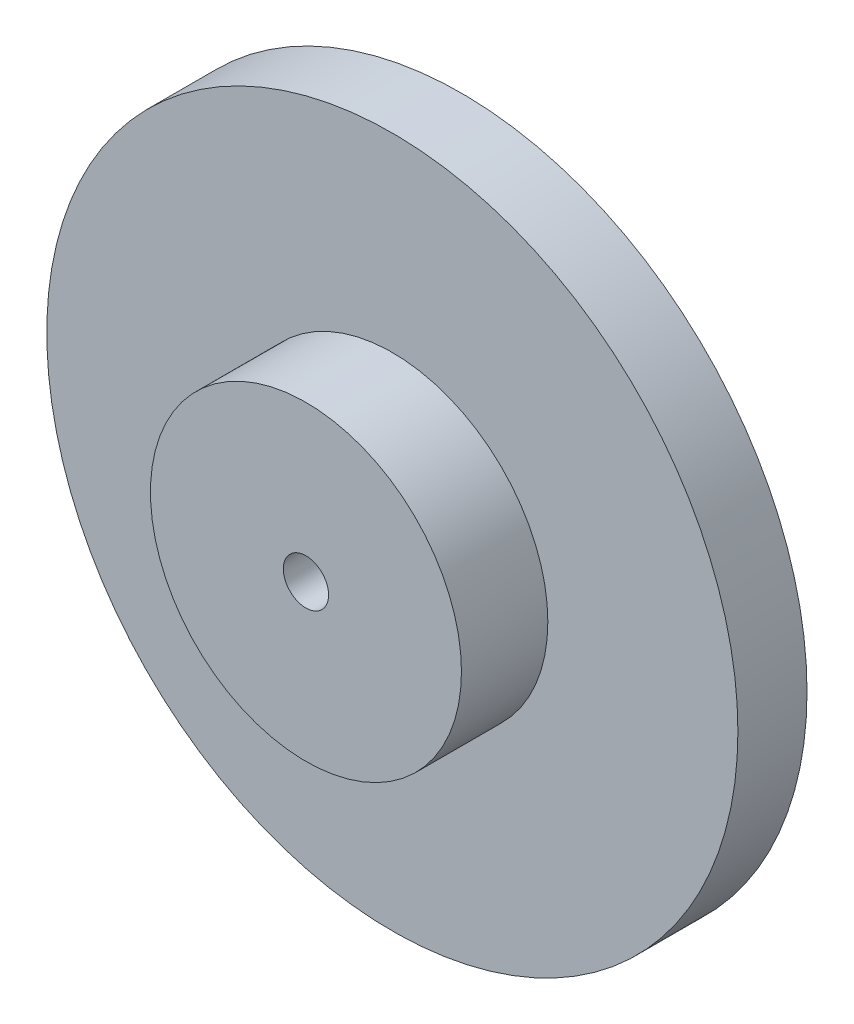
ISO-10303-21;
HEADER;
FILE_DESCRIPTION(('STEP AP214'),'2;1');
FILE_NAME('part.step','',(''),(''),'','','');
FILE_SCHEMA(('AUTOMOTIVE_DESIGN { 1 0 10303 214 1 1 1 1 }'));
ENDSEC;
DATA;
#1=APPLICATION_CONTEXT('core data for automotive mechanical design processes');
#2=APPLICATION_PROTOCOL_DEFINITION('international standard','automotive_design',2000,#1);
#3=PRODUCT_CONTEXT('',#1,'mechanical');
#4=PRODUCT('Part','Part','',(#3));
#5=PRODUCT_RELATED_PRODUCT_CATEGORY('part','',(#4));
#6=PRODUCT_DEFINITION_FORMATION('','',#4);
#7=PRODUCT_DEFINITION_CONTEXT('part definition',#1,'design');
#8=PRODUCT_DEFINITION('design','',#6,#7);
#9=PRODUCT_DEFINITION_SHAPE('','',#8);
#10=(LENGTH_UNIT() NAMED_UNIT(*) SI_UNIT(.MILLI.,.METRE.));
#11=(NAMED_UNIT(*) PLANE_ANGLE_UNIT() SI_UNIT($,.RADIAN.));
#12=(NAMED_UNIT(*) SI_UNIT($,.STERADIAN.) SOLID_ANGLE_UNIT());
#13=UNCERTAINTY_MEASURE_WITH_UNIT(LENGTH_MEASURE(1.E-05),#10,'distance_accuracy_value','');
#14=(GEOMETRIC_REPRESENTATION_CONTEXT(3) GLOBAL_UNCERTAINTY_ASSIGNED_CONTEXT((#13)) GLOBAL_UNIT_ASSIGNED_CONTEXT((#10,
#11,#12)) REPRESENTATION_CONTEXT('',''));
#15=CARTESIAN_POINT('',(0.,0.,0.));
#16=DIRECTION('',(0.,0.,1.));
#17=DIRECTION('',(1.,0.,0.));
#18=AXIS2_PLACEMENT_3D('',#15,#16,#17);
#19=CARTESIAN_POINT('',(0.,0.,2.));
#20=DIRECTION('',(0.,0.,-1.));
#21=DIRECTION('',(-1.,0.,0.));
#22=AXIS2_PLACEMENT_3D('',#19,#20,#21);
#23=CYLINDRICAL_SURFACE('',#22,10.);
#24=CARTESIAN_POINT('',(0.,0.,2.));
#25=DIRECTION('',(0.,0.,1.));
#26=DIRECTION('',(1.,0.,0.));
#27=AXIS2_PLACEMENT_3D('',#24,#25,#26);
#28=CIRCLE('',#27,10.);
#29=CARTESIAN_POINT('',(10.,0.,2.));
#30=VERTEX_POINT('',#29);
#31=EDGE_CURVE('E44',#30,#30,#28,.T.);
#32=ORIENTED_EDGE('',*,*,#31,.F.);
#33=EDGE_LOOP('',(#32));
#34=FACE_BOUND('',#33,.T.);
#35=CARTESIAN_POINT('',(0.,0.,0.));
#36=DIRECTION('',(0.,0.,1.));
#37=DIRECTION('',(1.,0.,0.));
#38=AXIS2_PLACEMENT_3D('',#35,#36,#37);
#39=CIRCLE('',#38,10.);
#40=CARTESIAN_POINT('',(10.,0.,0.));
#41=VERTEX_POINT('',#40);
#42=EDGE_CURVE('E40',#41,#41,#39,.T.);
#43=ORIENTED_EDGE('',*,*,#42,.T.);
#44=EDGE_LOOP('',(#43));
#45=FACE_BOUND('',#44,.T.);
#46=ADVANCED_FACE('F37',(#34,#45),#23,.T.);
#47=CARTESIAN_POINT('',(0.,0.,2.));
#48=DIRECTION('',(0.,0.,1.));
#49=DIRECTION('',(1.,0.,0.));
#50=AXIS2_PLACEMENT_3D('',#47,#48,#49);
#51=PLANE('',#50);
#52=CARTESIAN_POINT('',(0.,0.,2.));
#53=DIRECTION('',(0.,0.,1.));
#54=DIRECTION('',(1.,0.,0.));
#55=AXIS2_PLACEMENT_3D('',#52,#53,#54);
#56=CIRCLE('',#55,4.5);
#57=CARTESIAN_POINT('',(4.5,0.,2.));
#58=VERTEX_POINT('',#57);
#59=EDGE_CURVE('E10',#58,#58,#56,.T.);
#60=ORIENTED_EDGE('',*,*,#59,.F.);
#61=EDGE_LOOP('',(#60));
#62=FACE_BOUND('',#61,.T.);
#63=ORIENTED_EDGE('',*,*,#31,.T.);
#64=EDGE_LOOP('',(#63));
#65=FACE_BOUND('',#64,.T.);
#66=ADVANCED_FACE('F77',(#62,#65),#51,.T.);
#67=CARTESIAN_POINT('',(0.,0.,0.));
#68=DIRECTION('',(0.,0.,1.));
#69=DIRECTION('',(1.,0.,0.));
#70=AXIS2_PLACEMENT_3D('',#67,#68,#69);
#71=PLANE('',#70);
#72=CARTESIAN_POINT('',(0.,0.,0.));
#73=DIRECTION('',(0.,0.,1.));
#74=DIRECTION('',(1.,0.,0.));
#75=AXIS2_PLACEMENT_3D('',#72,#73,#74);
#76=CIRCLE('',#75,0.655025597228106);
#77=CARTESIAN_POINT('',(0.655025597228106,0.,0.));
#78=VERTEX_POINT('',#77);
#79=EDGE_CURVE('E53',#78,#78,#76,.T.);
#80=ORIENTED_EDGE('',*,*,#79,.T.);
#81=EDGE_LOOP('',(#80));
#82=FACE_BOUND('',#81,.T.);
#83=ORIENTED_EDGE('',*,*,#42,.F.);
#84=EDGE_LOOP('',(#83));
#85=FACE_BOUND('',#84,.T.);
#86=ADVANCED_FACE('F71',(#82,#85),#71,.F.);
#87=CARTESIAN_POINT('',(0.,0.,4.5));
#88=DIRECTION('',(0.,0.,-1.));
#89=DIRECTION('',(-1.,0.,0.));
#90=AXIS2_PLACEMENT_3D('',#87,#88,#89);
#91=CYLINDRICAL_SURFACE('',#90,4.5);
#92=CARTESIAN_POINT('',(0.,0.,4.5));
#93=DIRECTION('',(0.,0.,1.));
#94=DIRECTION('',(1.,0.,0.));
#95=AXIS2_PLACEMENT_3D('',#92,#93,#94);
#96=CIRCLE('',#95,4.5);
#97=CARTESIAN_POINT('',(4.5,0.,4.5));
#98=VERTEX_POINT('',#97);
#99=EDGE_CURVE('E50',#98,#98,#96,.T.);
#100=ORIENTED_EDGE('',*,*,#99,.F.);
#101=EDGE_LOOP('',(#100));
#102=FACE_BOUND('',#101,.T.);
#103=ORIENTED_EDGE('',*,*,#59,.T.);
#104=EDGE_LOOP('',(#103));
#105=FACE_BOUND('',#104,.T.);
#106=ADVANCED_FACE('F66',(#102,#105),#91,.T.);
#107=CARTESIAN_POINT('',(0.,0.,4.5));
#108=DIRECTION('',(0.,0.,1.));
#109=DIRECTION('',(1.,0.,0.));
#110=AXIS2_PLACEMENT_3D('',#107,#108,#109);
#111=PLANE('',#110);
#112=CARTESIAN_POINT('',(0.,0.,4.5));
#113=DIRECTION('',(0.,0.,1.));
#114=DIRECTION('',(1.,0.,0.));
#115=AXIS2_PLACEMENT_3D('',#112,#113,#114);
#116=CIRCLE('',#115,0.655025597228106);
#117=CARTESIAN_POINT('',(0.655025597228106,0.,4.5));
#118=VERTEX_POINT('',#117);
#119=EDGE_CURVE('E56',#118,#118,#116,.T.);
#120=ORIENTED_EDGE('',*,*,#119,.F.);
#121=EDGE_LOOP('',(#120));
#122=FACE_BOUND('',#121,.T.);
#123=ORIENTED_EDGE('',*,*,#99,.T.);
#124=EDGE_LOOP('',(#123));
#125=FACE_BOUND('',#124,.T.);
#126=ADVANCED_FACE('F63',(#122,#125),#111,.T.);
#127=CARTESIAN_POINT('',(0.,0.,-11.));
#128=DIRECTION('',(0.,0.,1.));
#129=DIRECTION('',(1.,0.,0.));
#130=AXIS2_PLACEMENT_3D('',#127,#128,#129);
#131=CYLINDRICAL_SURFACE('',#130,0.655025597228106);
#132=ORIENTED_EDGE('',*,*,#119,.T.);
#133=EDGE_LOOP('',(#132));
#134=FACE_BOUND('',#133,.T.);
#135=ORIENTED_EDGE('',*,*,#79,.F.);
#136=EDGE_LOOP('',(#135));
#137=FACE_BOUND('',#136,.T.);
#138=ADVANCED_FACE('F60',(#134,#137),#131,.F.);
#139=CLOSED_SHELL('',(#46,#66,#86,#106,#126,#138));
#140=MANIFOLD_SOLID_BREP('B2',#139);
#141=ADVANCED_BREP_SHAPE_REPRESENTATION('',(#18,#140),#14);
#142=SHAPE_DEFINITION_REPRESENTATION(#9,#141);
ENDSEC;
END-ISO-10303-21;
